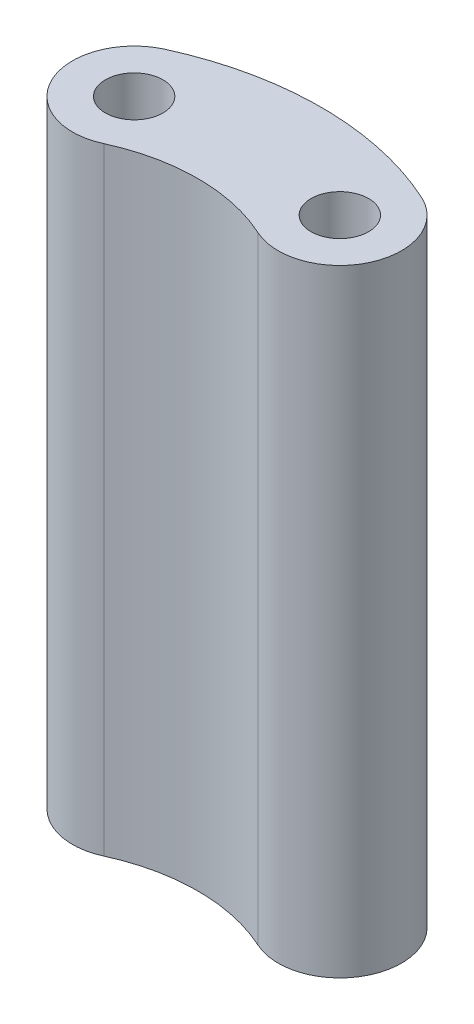
ISO-10303-21;
HEADER;
FILE_DESCRIPTION(('STEP AP214'),'2;1');
FILE_NAME('part.step','',(''),(''),'','','');
FILE_SCHEMA(('AUTOMOTIVE_DESIGN { 1 0 10303 214 1 1 1 1 }'));
ENDSEC;
DATA;
#1=APPLICATION_CONTEXT('core data for automotive mechanical design processes');
#2=APPLICATION_PROTOCOL_DEFINITION('international standard','automotive_design',2000,#1);
#3=PRODUCT_CONTEXT('',#1,'mechanical');
#4=PRODUCT('Part','Part','',(#3));
#5=PRODUCT_RELATED_PRODUCT_CATEGORY('part','',(#4));
#6=PRODUCT_DEFINITION_FORMATION('','',#4);
#7=PRODUCT_DEFINITION_CONTEXT('part definition',#1,'design');
#8=PRODUCT_DEFINITION('design','',#6,#7);
#9=PRODUCT_DEFINITION_SHAPE('','',#8);
#10=(LENGTH_UNIT() NAMED_UNIT(*) SI_UNIT(.MILLI.,.METRE.));
#11=(NAMED_UNIT(*) PLANE_ANGLE_UNIT() SI_UNIT($,.RADIAN.));
#12=(NAMED_UNIT(*) SI_UNIT($,.STERADIAN.) SOLID_ANGLE_UNIT());
#13=UNCERTAINTY_MEASURE_WITH_UNIT(LENGTH_MEASURE(1.E-05),#10,'distance_accuracy_value','');
#14=(GEOMETRIC_REPRESENTATION_CONTEXT(3) GLOBAL_UNCERTAINTY_ASSIGNED_CONTEXT((#13)) GLOBAL_UNIT_ASSIGNED_CONTEXT((#10,
#11,#12)) REPRESENTATION_CONTEXT('',''));
#15=CARTESIAN_POINT('',(0.,0.,0.));
#16=DIRECTION('',(0.,0.,1.));
#17=DIRECTION('',(1.,0.,0.));
#18=AXIS2_PLACEMENT_3D('',#15,#16,#17);
#19=CARTESIAN_POINT('',(5.,30.,-10.9087121146357));
#20=DIRECTION('',(0.,-1.,0.));
#21=DIRECTION('',(0.,0.,-1.));
#22=AXIS2_PLACEMENT_3D('',#19,#20,#21);
#23=CYLINDRICAL_SURFACE('',#22,3.);
#24=CARTESIAN_POINT('',(5.,0.,-10.9087121146357));
#25=DIRECTION('',(0.,1.,0.));
#26=DIRECTION('',(0.,0.,1.));
#27=AXIS2_PLACEMENT_3D('',#24,#25,#26);
#28=CIRCLE('',#27,3.);
#29=CARTESIAN_POINT('',(3.75,0.,-8.18153408597678));
#30=VERTEX_POINT('',#29);
#31=CARTESIAN_POINT('',(6.25,0.,-13.6358901432946));
#32=VERTEX_POINT('',#31);
#33=EDGE_CURVE('E104',#30,#32,#28,.T.);
#34=ORIENTED_EDGE('',*,*,#33,.T.);
#35=DIRECTION('',(0.,-1.,0.));
#36=VECTOR('',#35,1.);
#37=CARTESIAN_POINT('',(6.25,30.,-13.6358901432946));
#38=LINE('',#37,#36);
#39=CARTESIAN_POINT('',(6.25,30.,-13.6358901432946));
#40=VERTEX_POINT('',#39);
#41=EDGE_CURVE('E11',#40,#32,#38,.T.);
#42=ORIENTED_EDGE('',*,*,#41,.F.);
#43=CARTESIAN_POINT('',(5.,30.,-10.9087121146357));
#44=DIRECTION('',(0.,1.,0.));
#45=DIRECTION('',(0.,0.,1.));
#46=AXIS2_PLACEMENT_3D('',#43,#44,#45);
#47=CIRCLE('',#46,3.);
#48=CARTESIAN_POINT('',(3.75,30.,-8.18153408597678));
#49=VERTEX_POINT('',#48);
#50=EDGE_CURVE('E92',#49,#40,#47,.T.);
#51=ORIENTED_EDGE('',*,*,#50,.F.);
#52=DIRECTION('',(0.,-1.,0.));
#53=VECTOR('',#52,1.);
#54=CARTESIAN_POINT('',(3.75,30.,-8.18153408597678));
#55=LINE('',#54,#53);
#56=EDGE_CURVE('E100',#49,#30,#55,.T.);
#57=ORIENTED_EDGE('',*,*,#56,.T.);
#58=EDGE_LOOP('',(#34,#42,#51,#57));
#59=FACE_BOUND('',#58,.T.);
#60=ADVANCED_FACE('F41',(#59),#23,.T.);
#61=CARTESIAN_POINT('',(0.,30.,0.));
#62=DIRECTION('',(0.,-1.,0.));
#63=DIRECTION('',(0.,0.,-1.));
#64=AXIS2_PLACEMENT_3D('',#61,#62,#63);
#65=CYLINDRICAL_SURFACE('',#64,15.);
#66=CARTESIAN_POINT('',(0.,0.,0.));
#67=DIRECTION('',(0.,1.,0.));
#68=DIRECTION('',(0.,0.,1.));
#69=AXIS2_PLACEMENT_3D('',#66,#67,#68);
#70=CIRCLE('',#69,15.);
#71=CARTESIAN_POINT('',(-6.25,0.,-13.6358901432946));
#72=VERTEX_POINT('',#71);
#73=EDGE_CURVE('E96',#32,#72,#70,.T.);
#74=ORIENTED_EDGE('',*,*,#73,.T.);
#75=DIRECTION('',(0.,-1.,0.));
#76=VECTOR('',#75,1.);
#77=CARTESIAN_POINT('',(-6.25,30.,-13.6358901432946));
#78=LINE('',#77,#76);
#79=CARTESIAN_POINT('',(-6.25,30.,-13.6358901432946));
#80=VERTEX_POINT('',#79);
#81=EDGE_CURVE('E49',#80,#72,#78,.T.);
#82=ORIENTED_EDGE('',*,*,#81,.F.);
#83=CARTESIAN_POINT('',(0.,30.,0.));
#84=DIRECTION('',(0.,1.,0.));
#85=DIRECTION('',(0.,0.,1.));
#86=AXIS2_PLACEMENT_3D('',#83,#84,#85);
#87=CIRCLE('',#86,15.);
#88=EDGE_CURVE('E87',#40,#80,#87,.T.);
#89=ORIENTED_EDGE('',*,*,#88,.F.);
#90=ORIENTED_EDGE('',*,*,#41,.T.);
#91=EDGE_LOOP('',(#74,#82,#89,#90));
#92=FACE_BOUND('',#91,.T.);
#93=ADVANCED_FACE('F95',(#92),#65,.T.);
#94=CARTESIAN_POINT('',(-5.,30.,-10.9087121146357));
#95=DIRECTION('',(0.,-1.,0.));
#96=DIRECTION('',(0.,0.,-1.));
#97=AXIS2_PLACEMENT_3D('',#94,#95,#96);
#98=CYLINDRICAL_SURFACE('',#97,3.);
#99=CARTESIAN_POINT('',(-5.,0.,-10.9087121146357));
#100=DIRECTION('',(0.,1.,0.));
#101=DIRECTION('',(0.,0.,1.));
#102=AXIS2_PLACEMENT_3D('',#99,#100,#101);
#103=CIRCLE('',#102,3.);
#104=CARTESIAN_POINT('',(-3.75,0.,-8.18153408597679));
#105=VERTEX_POINT('',#104);
#106=EDGE_CURVE('E74',#72,#105,#103,.T.);
#107=ORIENTED_EDGE('',*,*,#106,.T.);
#108=DIRECTION('',(0.,-1.,0.));
#109=VECTOR('',#108,1.);
#110=CARTESIAN_POINT('',(-3.75,30.,-8.18153408597679));
#111=LINE('',#110,#109);
#112=CARTESIAN_POINT('',(-3.75,30.,-8.18153408597679));
#113=VERTEX_POINT('',#112);
#114=EDGE_CURVE('E97',#113,#105,#111,.T.);
#115=ORIENTED_EDGE('',*,*,#114,.F.);
#116=CARTESIAN_POINT('',(-5.,30.,-10.9087121146357));
#117=DIRECTION('',(0.,1.,0.));
#118=DIRECTION('',(0.,0.,1.));
#119=AXIS2_PLACEMENT_3D('',#116,#117,#118);
#120=CIRCLE('',#119,3.);
#121=EDGE_CURVE('E90',#80,#113,#120,.T.);
#122=ORIENTED_EDGE('',*,*,#121,.F.);
#123=ORIENTED_EDGE('',*,*,#81,.T.);
#124=EDGE_LOOP('',(#107,#115,#122,#123));
#125=FACE_BOUND('',#124,.T.);
#126=ADVANCED_FACE('F98',(#125),#98,.T.);
#127=CARTESIAN_POINT('',(0.,30.,0.));
#128=DIRECTION('',(0.,-1.,0.));
#129=DIRECTION('',(0.,0.,-1.));
#130=AXIS2_PLACEMENT_3D('',#127,#128,#129);
#131=CYLINDRICAL_SURFACE('',#130,9.);
#132=CARTESIAN_POINT('',(0.,0.,0.));
#133=DIRECTION('',(0.,-1.,0.));
#134=DIRECTION('',(0.,0.,1.));
#135=AXIS2_PLACEMENT_3D('',#132,#133,#134);
#136=CIRCLE('',#135,9.);
#137=EDGE_CURVE('E80',#105,#30,#136,.T.);
#138=ORIENTED_EDGE('',*,*,#137,.T.);
#139=ORIENTED_EDGE('',*,*,#56,.F.);
#140=CARTESIAN_POINT('',(0.,30.,0.));
#141=DIRECTION('',(0.,-1.,0.));
#142=DIRECTION('',(0.,0.,1.));
#143=AXIS2_PLACEMENT_3D('',#140,#141,#142);
#144=CIRCLE('',#143,9.);
#145=EDGE_CURVE('E57',#113,#49,#144,.T.);
#146=ORIENTED_EDGE('',*,*,#145,.F.);
#147=ORIENTED_EDGE('',*,*,#114,.T.);
#148=EDGE_LOOP('',(#138,#139,#146,#147));
#149=FACE_BOUND('',#148,.T.);
#150=ADVANCED_FACE('F112',(#149),#131,.F.);
#151=CARTESIAN_POINT('',(2.5,30.,-5.45435605731786));
#152=DIRECTION('',(0.,1.,0.));
#153=DIRECTION('',(0.,0.,1.));
#154=AXIS2_PLACEMENT_3D('',#151,#152,#153);
#155=PLANE('',#154);
#156=CARTESIAN_POINT('',(-5.,30.,-10.9087121146357));
#157=DIRECTION('',(0.,-1.,0.));
#158=DIRECTION('',(0.,0.,1.));
#159=AXIS2_PLACEMENT_3D('',#156,#157,#158);
#160=CIRCLE('',#159,1.4);
#161=CARTESIAN_POINT('',(-5.,30.,-9.50871211463571));
#162=VERTEX_POINT('',#161);
#163=EDGE_CURVE('E124',#162,#162,#160,.T.);
#164=ORIENTED_EDGE('',*,*,#163,.T.);
#165=EDGE_LOOP('',(#164));
#166=FACE_BOUND('',#165,.T.);
#167=CARTESIAN_POINT('',(5.,30.,-10.9087121146357));
#168=DIRECTION('',(0.,1.,0.));
#169=DIRECTION('',(0.,0.,1.));
#170=AXIS2_PLACEMENT_3D('',#167,#168,#169);
#171=CIRCLE('',#170,1.4);
#172=CARTESIAN_POINT('',(5.,30.,-9.50871211463571));
#173=VERTEX_POINT('',#172);
#174=EDGE_CURVE('E118',#173,#173,#171,.T.);
#175=ORIENTED_EDGE('',*,*,#174,.F.);
#176=EDGE_LOOP('',(#175));
#177=FACE_BOUND('',#176,.T.);
#178=ORIENTED_EDGE('',*,*,#50,.T.);
#179=ORIENTED_EDGE('',*,*,#88,.T.);
#180=ORIENTED_EDGE('',*,*,#121,.T.);
#181=ORIENTED_EDGE('',*,*,#145,.T.);
#182=EDGE_LOOP('',(#178,#179,#180,#181));
#183=FACE_BOUND('',#182,.T.);
#184=ADVANCED_FACE('F88',(#166,#177,#183),#155,.T.);
#185=CARTESIAN_POINT('',(2.5,0.,-5.45435605731786));
#186=DIRECTION('',(0.,1.,0.));
#187=DIRECTION('',(0.,0.,1.));
#188=AXIS2_PLACEMENT_3D('',#185,#186,#187);
#189=PLANE('',#188);
#190=CARTESIAN_POINT('',(-5.,0.,-10.9087121146357));
#191=DIRECTION('',(0.,-1.,0.));
#192=DIRECTION('',(0.,0.,1.));
#193=AXIS2_PLACEMENT_3D('',#190,#191,#192);
#194=CIRCLE('',#193,1.4);
#195=CARTESIAN_POINT('',(-5.,0.,-9.50871211463571));
#196=VERTEX_POINT('',#195);
#197=EDGE_CURVE('E136',#196,#196,#194,.T.);
#198=ORIENTED_EDGE('',*,*,#197,.F.);
#199=EDGE_LOOP('',(#198));
#200=FACE_BOUND('',#199,.T.);
#201=CARTESIAN_POINT('',(5.,0.,-10.9087121146357));
#202=DIRECTION('',(0.,1.,0.));
#203=DIRECTION('',(0.,0.,1.));
#204=AXIS2_PLACEMENT_3D('',#201,#202,#203);
#205=CIRCLE('',#204,1.4);
#206=CARTESIAN_POINT('',(5.,0.,-9.50871211463571));
#207=VERTEX_POINT('',#206);
#208=EDGE_CURVE('E130',#207,#207,#205,.T.);
#209=ORIENTED_EDGE('',*,*,#208,.T.);
#210=EDGE_LOOP('',(#209));
#211=FACE_BOUND('',#210,.T.);
#212=ORIENTED_EDGE('',*,*,#33,.F.);
#213=ORIENTED_EDGE('',*,*,#137,.F.);
#214=ORIENTED_EDGE('',*,*,#106,.F.);
#215=ORIENTED_EDGE('',*,*,#73,.F.);
#216=EDGE_LOOP('',(#212,#213,#214,#215));
#217=FACE_BOUND('',#216,.T.);
#218=ADVANCED_FACE('F115',(#200,#211,#217),#189,.F.);
#219=CARTESIAN_POINT('',(5.,25.,-10.9087121146357));
#220=DIRECTION('',(0.,1.,0.));
#221=DIRECTION('',(0.,0.,1.));
#222=AXIS2_PLACEMENT_3D('',#219,#220,#221);
#223=CYLINDRICAL_SURFACE('',#222,1.4);
#224=CARTESIAN_POINT('',(5.,25.,-10.9087121146357));
#225=DIRECTION('',(0.,1.,0.));
#226=DIRECTION('',(0.,0.,1.));
#227=AXIS2_PLACEMENT_3D('',#224,#225,#226);
#228=CIRCLE('',#227,1.4);
#229=CARTESIAN_POINT('',(5.,25.,-9.50871211463571));
#230=VERTEX_POINT('',#229);
#231=EDGE_CURVE('E107',#230,#230,#228,.T.);
#232=ORIENTED_EDGE('',*,*,#231,.F.);
#233=EDGE_LOOP('',(#232));
#234=FACE_BOUND('',#233,.T.);
#235=ORIENTED_EDGE('',*,*,#174,.T.);
#236=EDGE_LOOP('',(#235));
#237=FACE_BOUND('',#236,.T.);
#238=ADVANCED_FACE('F153',(#234,#237),#223,.F.);
#239=CARTESIAN_POINT('',(5.,25.,-10.9087121146357));
#240=DIRECTION('',(0.,1.,0.));
#241=DIRECTION('',(0.,0.,1.));
#242=AXIS2_PLACEMENT_3D('',#239,#240,#241);
#243=PLANE('',#242);
#244=ORIENTED_EDGE('',*,*,#231,.T.);
#245=EDGE_LOOP('',(#244));
#246=FACE_BOUND('',#245,.T.);
#247=ADVANCED_FACE('F187',(#246),#243,.T.);
#248=CARTESIAN_POINT('',(-5.,25.,-10.9087121146357));
#249=DIRECTION('',(0.,1.,0.));
#250=DIRECTION('',(0.,0.,1.));
#251=AXIS2_PLACEMENT_3D('',#248,#249,#250);
#252=CYLINDRICAL_SURFACE('',#251,1.4);
#253=CARTESIAN_POINT('',(-5.,25.,-10.9087121146357));
#254=DIRECTION('',(0.,-1.,0.));
#255=DIRECTION('',(0.,0.,1.));
#256=AXIS2_PLACEMENT_3D('',#253,#254,#255);
#257=CIRCLE('',#256,1.4);
#258=CARTESIAN_POINT('',(-5.,25.,-9.50871211463571));
#259=VERTEX_POINT('',#258);
#260=EDGE_CURVE('E121',#259,#259,#257,.T.);
#261=ORIENTED_EDGE('',*,*,#260,.T.);
#262=EDGE_LOOP('',(#261));
#263=FACE_BOUND('',#262,.T.);
#264=ORIENTED_EDGE('',*,*,#163,.F.);
#265=EDGE_LOOP('',(#264));
#266=FACE_BOUND('',#265,.T.);
#267=ADVANCED_FACE('F168',(#263,#266),#252,.F.);
#268=CARTESIAN_POINT('',(-5.,25.,-10.9087121146357));
#269=DIRECTION('',(0.,1.,0.));
#270=DIRECTION('',(0.,0.,1.));
#271=AXIS2_PLACEMENT_3D('',#268,#269,#270);
#272=PLANE('',#271);
#273=ORIENTED_EDGE('',*,*,#260,.F.);
#274=EDGE_LOOP('',(#273));
#275=FACE_BOUND('',#274,.T.);
#276=ADVANCED_FACE('F159',(#275),#272,.T.);
#277=CARTESIAN_POINT('',(5.,5.,-10.9087121146357));
#278=DIRECTION('',(0.,-1.,0.));
#279=DIRECTION('',(0.,0.,-1.));
#280=AXIS2_PLACEMENT_3D('',#277,#278,#279);
#281=CYLINDRICAL_SURFACE('',#280,1.4);
#282=CARTESIAN_POINT('',(5.,5.,-10.9087121146357));
#283=DIRECTION('',(0.,1.,0.));
#284=DIRECTION('',(0.,0.,1.));
#285=AXIS2_PLACEMENT_3D('',#282,#283,#284);
#286=CIRCLE('',#285,1.4);
#287=CARTESIAN_POINT('',(5.,5.,-9.50871211463571));
#288=VERTEX_POINT('',#287);
#289=EDGE_CURVE('E127',#288,#288,#286,.T.);
#290=ORIENTED_EDGE('',*,*,#289,.T.);
#291=EDGE_LOOP('',(#290));
#292=FACE_BOUND('',#291,.T.);
#293=ORIENTED_EDGE('',*,*,#208,.F.);
#294=EDGE_LOOP('',(#293));
#295=FACE_BOUND('',#294,.T.);
#296=ADVANCED_FACE('F157',(#292,#295),#281,.F.);
#297=CARTESIAN_POINT('',(5.,5.,-10.9087121146357));
#298=DIRECTION('',(0.,-1.,0.));
#299=DIRECTION('',(0.,0.,1.));
#300=AXIS2_PLACEMENT_3D('',#297,#298,#299);
#301=PLANE('',#300);
#302=ORIENTED_EDGE('',*,*,#289,.F.);
#303=EDGE_LOOP('',(#302));
#304=FACE_BOUND('',#303,.T.);
#305=ADVANCED_FACE('F147',(#304),#301,.T.);
#306=CARTESIAN_POINT('',(-5.,5.,-10.9087121146357));
#307=DIRECTION('',(0.,-1.,0.));
#308=DIRECTION('',(0.,0.,-1.));
#309=AXIS2_PLACEMENT_3D('',#306,#307,#308);
#310=CYLINDRICAL_SURFACE('',#309,1.4);
#311=CARTESIAN_POINT('',(-5.,5.,-10.9087121146357));
#312=DIRECTION('',(0.,-1.,0.));
#313=DIRECTION('',(0.,0.,1.));
#314=AXIS2_PLACEMENT_3D('',#311,#312,#313);
#315=CIRCLE('',#314,1.4);
#316=CARTESIAN_POINT('',(-5.,5.,-9.50871211463571));
#317=VERTEX_POINT('',#316);
#318=EDGE_CURVE('E133',#317,#317,#315,.T.);
#319=ORIENTED_EDGE('',*,*,#318,.F.);
#320=EDGE_LOOP('',(#319));
#321=FACE_BOUND('',#320,.T.);
#322=ORIENTED_EDGE('',*,*,#197,.T.);
#323=EDGE_LOOP('',(#322));
#324=FACE_BOUND('',#323,.T.);
#325=ADVANCED_FACE('F144',(#321,#324),#310,.F.);
#326=CARTESIAN_POINT('',(-5.,5.,-10.9087121146357));
#327=DIRECTION('',(0.,-1.,0.));
#328=DIRECTION('',(0.,0.,1.));
#329=AXIS2_PLACEMENT_3D('',#326,#327,#328);
#330=PLANE('',#329);
#331=ORIENTED_EDGE('',*,*,#318,.T.);
#332=EDGE_LOOP('',(#331));
#333=FACE_BOUND('',#332,.T.);
#334=ADVANCED_FACE('F142',(#333),#330,.T.);
#335=CLOSED_SHELL('',(#60,#93,#126,#150,#184,#218,#238,#247,#267,#276,#296,#305,#325,#334));
#336=MANIFOLD_SOLID_BREP('B2',#335);
#337=ADVANCED_BREP_SHAPE_REPRESENTATION('',(#18,#336),#14);
#338=SHAPE_DEFINITION_REPRESENTATION(#9,#337);
ENDSEC;
END-ISO-10303-21;
